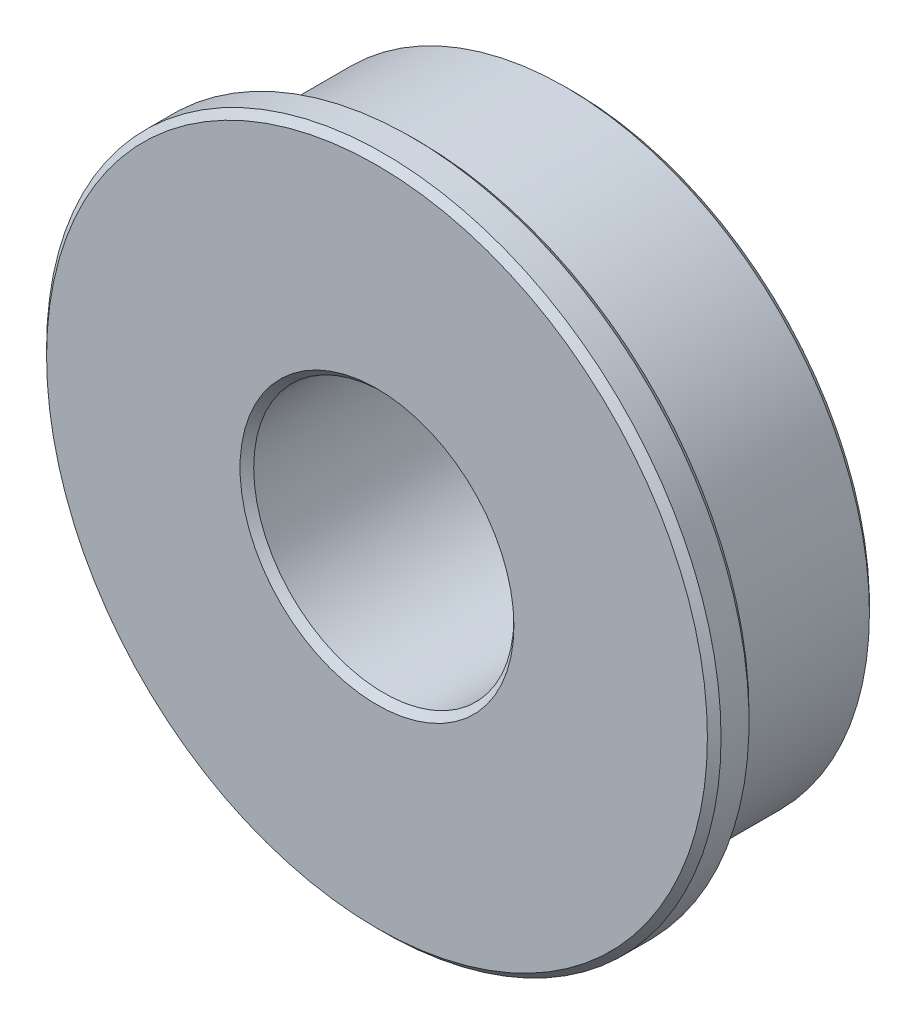
ISO-10303-21;
HEADER;
FILE_DESCRIPTION(('STEP AP214'),'2;1');
FILE_NAME('part.step','',(''),(''),'','','');
FILE_SCHEMA(('AUTOMOTIVE_DESIGN { 1 0 10303 214 1 1 1 1 }'));
ENDSEC;
DATA;
#1=APPLICATION_CONTEXT('core data for automotive mechanical design processes');
#2=APPLICATION_PROTOCOL_DEFINITION('international standard','automotive_design',2000,#1);
#3=PRODUCT_CONTEXT('',#1,'mechanical');
#4=PRODUCT('Part','Part','',(#3));
#5=PRODUCT_RELATED_PRODUCT_CATEGORY('part','',(#4));
#6=PRODUCT_DEFINITION_FORMATION('','',#4);
#7=PRODUCT_DEFINITION_CONTEXT('part definition',#1,'design');
#8=PRODUCT_DEFINITION('design','',#6,#7);
#9=PRODUCT_DEFINITION_SHAPE('','',#8);
#10=(LENGTH_UNIT() NAMED_UNIT(*) SI_UNIT(.MILLI.,.METRE.));
#11=(NAMED_UNIT(*) PLANE_ANGLE_UNIT() SI_UNIT($,.RADIAN.));
#12=(NAMED_UNIT(*) SI_UNIT($,.STERADIAN.) SOLID_ANGLE_UNIT());
#13=UNCERTAINTY_MEASURE_WITH_UNIT(LENGTH_MEASURE(1.E-05),#10,'distance_accuracy_value','');
#14=(GEOMETRIC_REPRESENTATION_CONTEXT(3) GLOBAL_UNCERTAINTY_ASSIGNED_CONTEXT((#13)) GLOBAL_UNIT_ASSIGNED_CONTEXT((#10,
#11,#12)) REPRESENTATION_CONTEXT('',''));
#15=CARTESIAN_POINT('',(0.,0.,0.));
#16=DIRECTION('',(0.,0.,1.));
#17=DIRECTION('',(1.,0.,0.));
#18=AXIS2_PLACEMENT_3D('',#15,#16,#17);
#19=CARTESIAN_POINT('',(-11.1124982833595,0.,5.63883000733978));
#20=DIRECTION('',(0.,0.,-1.));
#21=DIRECTION('',(-1.,0.,0.));
#22=AXIS2_PLACEMENT_3D('',#19,#20,#21);
#23=PLANE('',#22);
#24=CARTESIAN_POINT('',(0.,0.,5.63883000733978));
#25=DIRECTION('',(0.,0.,-1.));
#26=DIRECTION('',(-1.,0.,0.));
#27=AXIS2_PLACEMENT_3D('',#24,#25,#26);
#28=CIRCLE('',#27,12.0943995392328);
#29=CARTESIAN_POINT('',(-12.0943995392328,0.,5.63883000733978));
#30=VERTEX_POINT('',#29);
#31=EDGE_CURVE('E45',#30,#30,#28,.T.);
#32=ORIENTED_EDGE('',*,*,#31,.T.);
#33=EDGE_LOOP('',(#32));
#34=FACE_BOUND('',#33,.T.);
#35=CARTESIAN_POINT('',(0.,0.,5.63883000733978));
#36=DIRECTION('',(0.,0.,-1.));
#37=DIRECTION('',(-1.,0.,0.));
#38=AXIS2_PLACEMENT_3D('',#35,#36,#37);
#39=CIRCLE('',#38,11.1124982833595);
#40=CARTESIAN_POINT('',(-11.1124982833595,0.,5.63883000733978));
#41=VERTEX_POINT('',#40);
#42=EDGE_CURVE('E72',#41,#41,#39,.T.);
#43=ORIENTED_EDGE('',*,*,#42,.F.);
#44=EDGE_LOOP('',(#43));
#45=FACE_BOUND('',#44,.T.);
#46=ADVANCED_FACE('F34',(#34,#45),#23,.T.);
#47=CARTESIAN_POINT('',(0.,0.,0.));
#48=DIRECTION('',(0.,0.,-1.));
#49=DIRECTION('',(-1.,0.,0.));
#50=AXIS2_PLACEMENT_3D('',#47,#48,#49);
#51=CYLINDRICAL_SURFACE('',#50,12.3443995392328);
#52=CARTESIAN_POINT('',(0.,0.,5.88883000733977));
#53=DIRECTION('',(0.,0.,-1.));
#54=DIRECTION('',(-1.,0.,0.));
#55=AXIS2_PLACEMENT_3D('',#52,#53,#54);
#56=CIRCLE('',#55,12.3443995392328);
#57=CARTESIAN_POINT('',(-12.3443995392328,0.,5.88883000733977));
#58=VERTEX_POINT('',#57);
#59=EDGE_CURVE('E10',#58,#58,#56,.F.);
#60=ORIENTED_EDGE('',*,*,#59,.T.);
#61=EDGE_LOOP('',(#60));
#62=FACE_BOUND('',#61,.T.);
#63=CARTESIAN_POINT('',(0.,0.,6.91282915154652));
#64=DIRECTION('',(0.,0.,1.));
#65=DIRECTION('',(1.,0.,0.));
#66=AXIS2_PLACEMENT_3D('',#63,#64,#65);
#67=CIRCLE('',#66,12.3443995392328);
#68=CARTESIAN_POINT('',(12.3443995392328,0.,6.91282915154652));
#69=VERTEX_POINT('',#68);
#70=EDGE_CURVE('E41',#69,#69,#67,.F.);
#71=ORIENTED_EDGE('',*,*,#70,.T.);
#72=EDGE_LOOP('',(#71));
#73=FACE_BOUND('',#72,.T.);
#74=ADVANCED_FACE('F79',(#62,#73),#51,.T.);
#75=CARTESIAN_POINT('',(-12.3443995392328,0.,7.16282915154652));
#76=DIRECTION('',(0.,0.,1.));
#77=DIRECTION('',(1.,0.,0.));
#78=AXIS2_PLACEMENT_3D('',#75,#76,#77);
#79=PLANE('',#78);
#80=CARTESIAN_POINT('',(0.,0.,7.16282915154652));
#81=DIRECTION('',(0.,0.,1.));
#82=DIRECTION('',(1.,0.,0.));
#83=AXIS2_PLACEMENT_3D('',#80,#81,#82);
#84=CIRCLE('',#83,5.01249899298644);
#85=CARTESIAN_POINT('',(5.01249899298644,0.,7.16282915154652));
#86=VERTEX_POINT('',#85);
#87=EDGE_CURVE('E49',#86,#86,#84,.F.);
#88=ORIENTED_EDGE('',*,*,#87,.T.);
#89=EDGE_LOOP('',(#88));
#90=FACE_BOUND('',#89,.T.);
#91=CARTESIAN_POINT('',(0.,0.,7.16282915154652));
#92=DIRECTION('',(0.,0.,1.));
#93=DIRECTION('',(1.,0.,0.));
#94=AXIS2_PLACEMENT_3D('',#91,#92,#93);
#95=CIRCLE('',#94,12.0943995392328);
#96=CARTESIAN_POINT('',(12.0943995392328,0.,7.16282915154652));
#97=VERTEX_POINT('',#96);
#98=EDGE_CURVE('E54',#97,#97,#95,.T.);
#99=ORIENTED_EDGE('',*,*,#98,.T.);
#100=EDGE_LOOP('',(#99));
#101=FACE_BOUND('',#100,.T.);
#102=ADVANCED_FACE('F85',(#90,#101),#79,.T.);
#103=CARTESIAN_POINT('',(0.,0.,0.));
#104=DIRECTION('',(0.,0.,-1.));
#105=DIRECTION('',(-1.,0.,0.));
#106=AXIS2_PLACEMENT_3D('',#103,#104,#105);
#107=CYLINDRICAL_SURFACE('',#106,4.76249899298644);
#108=CARTESIAN_POINT('',(0.,0.,0.250029130738314));
#109=DIRECTION('',(0.,0.,-1.));
#110=DIRECTION('',(-1.,0.,0.));
#111=AXIS2_PLACEMENT_3D('',#108,#109,#110);
#112=CIRCLE('',#111,4.76249899298644);
#113=CARTESIAN_POINT('',(-4.76249899298644,0.,0.250029130738314));
#114=VERTEX_POINT('',#113);
#115=EDGE_CURVE('E66',#114,#114,#112,.T.);
#116=ORIENTED_EDGE('',*,*,#115,.T.);
#117=EDGE_LOOP('',(#116));
#118=FACE_BOUND('',#117,.T.);
#119=CARTESIAN_POINT('',(0.,0.,6.91282915154652));
#120=DIRECTION('',(0.,0.,1.));
#121=DIRECTION('',(1.,0.,0.));
#122=AXIS2_PLACEMENT_3D('',#119,#120,#121);
#123=CIRCLE('',#122,4.76249899298644);
#124=CARTESIAN_POINT('',(4.76249899298644,0.,6.91282915154652));
#125=VERTEX_POINT('',#124);
#126=EDGE_CURVE('E69',#125,#125,#123,.T.);
#127=ORIENTED_EDGE('',*,*,#126,.T.);
#128=EDGE_LOOP('',(#127));
#129=FACE_BOUND('',#128,.T.);
#130=ADVANCED_FACE('F115',(#118,#129),#107,.F.);
#131=CARTESIAN_POINT('',(-4.76249899298644,0.,2.91307383150088E-05));
#132=DIRECTION('',(0.,0.,-1.));
#133=DIRECTION('',(-1.,0.,0.));
#134=AXIS2_PLACEMENT_3D('',#131,#132,#133);
#135=PLANE('',#134);
#136=CARTESIAN_POINT('',(0.,0.,2.91307383150088E-05));
#137=DIRECTION('',(0.,0.,-1.));
#138=DIRECTION('',(-1.,0.,0.));
#139=AXIS2_PLACEMENT_3D('',#136,#137,#138);
#140=CIRCLE('',#139,5.01249899298644);
#141=CARTESIAN_POINT('',(-5.01249899298644,0.,2.91307383150088E-05));
#142=VERTEX_POINT('',#141);
#143=EDGE_CURVE('E60',#142,#142,#140,.F.);
#144=ORIENTED_EDGE('',*,*,#143,.T.);
#145=EDGE_LOOP('',(#144));
#146=FACE_BOUND('',#145,.T.);
#147=CARTESIAN_POINT('',(0.,0.,2.91307383150088E-05));
#148=DIRECTION('',(0.,0.,-1.));
#149=DIRECTION('',(-1.,0.,0.));
#150=AXIS2_PLACEMENT_3D('',#147,#148,#149);
#151=CIRCLE('',#150,10.8624982833595);
#152=CARTESIAN_POINT('',(-10.8624982833595,0.,2.91307383150088E-05));
#153=VERTEX_POINT('',#152);
#154=EDGE_CURVE('E63',#153,#153,#151,.T.);
#155=ORIENTED_EDGE('',*,*,#154,.T.);
#156=EDGE_LOOP('',(#155));
#157=FACE_BOUND('',#156,.T.);
#158=ADVANCED_FACE('F120',(#146,#157),#135,.T.);
#159=CARTESIAN_POINT('',(0.,0.,0.));
#160=DIRECTION('',(0.,0.,-1.));
#161=DIRECTION('',(-1.,0.,0.));
#162=AXIS2_PLACEMENT_3D('',#159,#160,#161);
#163=CYLINDRICAL_SURFACE('',#162,11.1124982833595);
#164=CARTESIAN_POINT('',(0.,0.,0.250029130738317));
#165=DIRECTION('',(0.,0.,-1.));
#166=DIRECTION('',(-1.,0.,0.));
#167=AXIS2_PLACEMENT_3D('',#164,#165,#166);
#168=CIRCLE('',#167,11.1124982833595);
#169=CARTESIAN_POINT('',(-11.1124982833595,0.,0.250029130738317));
#170=VERTEX_POINT('',#169);
#171=EDGE_CURVE('E57',#170,#170,#168,.F.);
#172=ORIENTED_EDGE('',*,*,#171,.T.);
#173=EDGE_LOOP('',(#172));
#174=FACE_BOUND('',#173,.T.);
#175=ORIENTED_EDGE('',*,*,#42,.T.);
#176=EDGE_LOOP('',(#175));
#177=FACE_BOUND('',#176,.T.);
#178=ADVANCED_FACE('F76',(#174,#177),#163,.T.);
#179=CARTESIAN_POINT('',(0.,0.,0.250029130738314));
#180=DIRECTION('',(0.,0.,-1.));
#181=DIRECTION('',(-1.,0.,0.));
#182=AXIS2_PLACEMENT_3D('',#179,#180,#181);
#183=CONICAL_SURFACE('',#182,4.76249899298644,0.785398163397452);
#184=ORIENTED_EDGE('',*,*,#143,.F.);
#185=EDGE_LOOP('',(#184));
#186=FACE_BOUND('',#185,.T.);
#187=ORIENTED_EDGE('',*,*,#115,.F.);
#188=EDGE_LOOP('',(#187));
#189=FACE_BOUND('',#188,.T.);
#190=ADVANCED_FACE('F89',(#186,#189),#183,.F.);
#191=CARTESIAN_POINT('',(0.,0.,2.91307383150088E-05));
#192=DIRECTION('',(0.,0.,1.));
#193=DIRECTION('',(1.,0.,0.));
#194=AXIS2_PLACEMENT_3D('',#191,#192,#193);
#195=CONICAL_SURFACE('',#194,10.8624982833595,0.785398163397441);
#196=ORIENTED_EDGE('',*,*,#171,.F.);
#197=EDGE_LOOP('',(#196));
#198=FACE_BOUND('',#197,.T.);
#199=ORIENTED_EDGE('',*,*,#154,.F.);
#200=EDGE_LOOP('',(#199));
#201=FACE_BOUND('',#200,.T.);
#202=ADVANCED_FACE('F92',(#198,#201),#195,.T.);
#203=CARTESIAN_POINT('',(0.,0.,7.16282915154652));
#204=DIRECTION('',(0.,0.,1.));
#205=DIRECTION('',(1.,0.,0.));
#206=AXIS2_PLACEMENT_3D('',#203,#204,#205);
#207=CONICAL_SURFACE('',#206,5.01249899298644,0.785398163397452);
#208=ORIENTED_EDGE('',*,*,#126,.F.);
#209=EDGE_LOOP('',(#208));
#210=FACE_BOUND('',#209,.T.);
#211=ORIENTED_EDGE('',*,*,#87,.F.);
#212=EDGE_LOOP('',(#211));
#213=FACE_BOUND('',#212,.T.);
#214=ADVANCED_FACE('F96',(#210,#213),#207,.F.);
#215=CARTESIAN_POINT('',(0.,0.,5.63883000733978));
#216=DIRECTION('',(0.,0.,1.));
#217=DIRECTION('',(1.,0.,0.));
#218=AXIS2_PLACEMENT_3D('',#215,#216,#217);
#219=CONICAL_SURFACE('',#218,12.0943995392328,0.785398163397445);
#220=ORIENTED_EDGE('',*,*,#59,.F.);
#221=EDGE_LOOP('',(#220));
#222=FACE_BOUND('',#221,.T.);
#223=ORIENTED_EDGE('',*,*,#31,.F.);
#224=EDGE_LOOP('',(#223));
#225=FACE_BOUND('',#224,.T.);
#226=ADVANCED_FACE('F99',(#222,#225),#219,.T.);
#227=CARTESIAN_POINT('',(0.,0.,6.91282915154652));
#228=DIRECTION('',(0.,0.,-1.));
#229=DIRECTION('',(-1.,0.,0.));
#230=AXIS2_PLACEMENT_3D('',#227,#228,#229);
#231=CONICAL_SURFACE('',#230,12.3443995392328,0.785398163397448);
#232=ORIENTED_EDGE('',*,*,#98,.F.);
#233=EDGE_LOOP('',(#232));
#234=FACE_BOUND('',#233,.T.);
#235=ORIENTED_EDGE('',*,*,#70,.F.);
#236=EDGE_LOOP('',(#235));
#237=FACE_BOUND('',#236,.T.);
#238=ADVANCED_FACE('F36',(#234,#237),#231,.T.);
#239=CLOSED_SHELL('',(#46,#74,#102,#130,#158,#178,#190,#202,#214,#226,#238));
#240=MANIFOLD_SOLID_BREP('B2',#239);
#241=ADVANCED_BREP_SHAPE_REPRESENTATION('',(#18,#240),#14);
#242=SHAPE_DEFINITION_REPRESENTATION(#9,#241);
ENDSEC;
END-ISO-10303-21;
